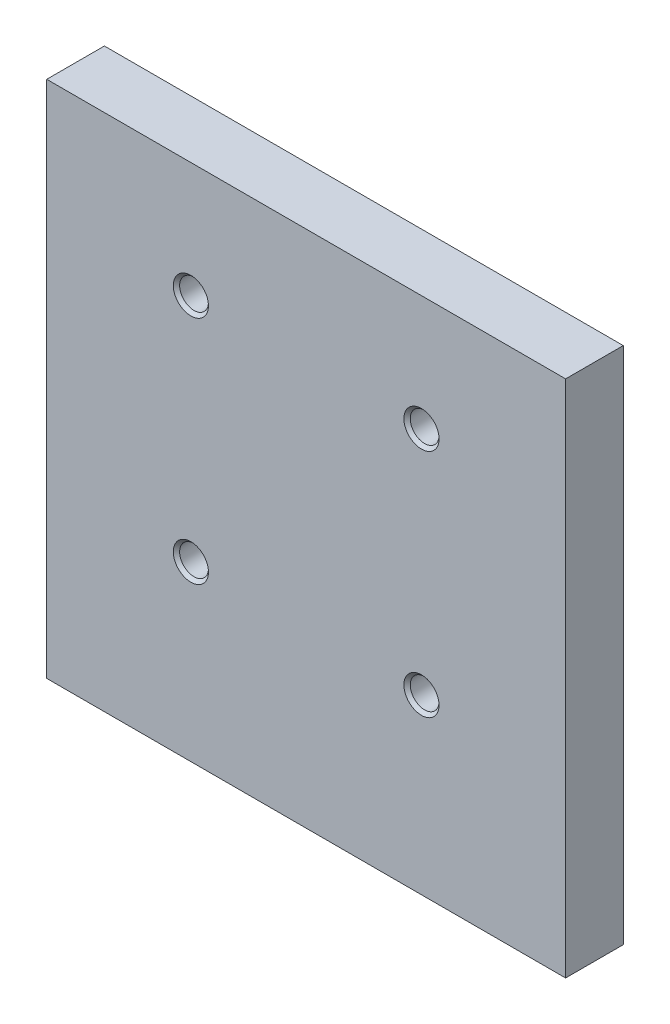
ISO-10303-21;
HEADER;
FILE_DESCRIPTION(('STEP AP214'),'2;1');
FILE_NAME('part.step','',(''),(''),'','','');
FILE_SCHEMA(('AUTOMOTIVE_DESIGN { 1 0 10303 214 1 1 1 1 }'));
ENDSEC;
DATA;
#1=APPLICATION_CONTEXT('core data for automotive mechanical design processes');
#2=APPLICATION_PROTOCOL_DEFINITION('international standard','automotive_design',2000,#1);
#3=PRODUCT_CONTEXT('',#1,'mechanical');
#4=PRODUCT('Part','Part','',(#3));
#5=PRODUCT_RELATED_PRODUCT_CATEGORY('part','',(#4));
#6=PRODUCT_DEFINITION_FORMATION('','',#4);
#7=PRODUCT_DEFINITION_CONTEXT('part definition',#1,'design');
#8=PRODUCT_DEFINITION('design','',#6,#7);
#9=PRODUCT_DEFINITION_SHAPE('','',#8);
#10=(LENGTH_UNIT() NAMED_UNIT(*) SI_UNIT(.MILLI.,.METRE.));
#11=(NAMED_UNIT(*) PLANE_ANGLE_UNIT() SI_UNIT($,.RADIAN.));
#12=(NAMED_UNIT(*) SI_UNIT($,.STERADIAN.) SOLID_ANGLE_UNIT());
#13=UNCERTAINTY_MEASURE_WITH_UNIT(LENGTH_MEASURE(1.E-05),#10,'distance_accuracy_value','');
#14=(GEOMETRIC_REPRESENTATION_CONTEXT(3) GLOBAL_UNCERTAINTY_ASSIGNED_CONTEXT((#13)) GLOBAL_UNIT_ASSIGNED_CONTEXT((#10,
#11,#12)) REPRESENTATION_CONTEXT('',''));
#15=CARTESIAN_POINT('',(0.,0.,0.));
#16=DIRECTION('',(0.,0.,1.));
#17=DIRECTION('',(1.,0.,0.));
#18=AXIS2_PLACEMENT_3D('',#15,#16,#17);
#19=CARTESIAN_POINT('',(0.,0.,5.));
#20=DIRECTION('',(1.,0.,0.));
#21=DIRECTION('',(0.,0.,-1.));
#22=AXIS2_PLACEMENT_3D('',#19,#20,#21);
#23=PLANE('',#22);
#24=DIRECTION('',(0.,-1.,0.));
#25=VECTOR('',#24,1.);
#26=CARTESIAN_POINT('',(0.,0.,0.));
#27=LINE('',#26,#25);
#28=CARTESIAN_POINT('',(0.,45.,0.));
#29=VERTEX_POINT('',#28);
#30=CARTESIAN_POINT('',(0.,0.,0.));
#31=VERTEX_POINT('',#30);
#32=EDGE_CURVE('E125',#29,#31,#27,.T.);
#33=ORIENTED_EDGE('',*,*,#32,.T.);
#34=DIRECTION('',(0.,0.,-1.));
#35=VECTOR('',#34,1.);
#36=CARTESIAN_POINT('',(0.,0.,5.));
#37=LINE('',#36,#35);
#38=CARTESIAN_POINT('',(0.,0.,5.));
#39=VERTEX_POINT('',#38);
#40=EDGE_CURVE('E11',#39,#31,#37,.T.);
#41=ORIENTED_EDGE('',*,*,#40,.F.);
#42=DIRECTION('',(0.,-1.,0.));
#43=VECTOR('',#42,1.);
#44=CARTESIAN_POINT('',(0.,0.,5.));
#45=LINE('',#44,#43);
#46=CARTESIAN_POINT('',(0.,45.,5.));
#47=VERTEX_POINT('',#46);
#48=EDGE_CURVE('E107',#47,#39,#45,.T.);
#49=ORIENTED_EDGE('',*,*,#48,.F.);
#50=DIRECTION('',(0.,0.,-1.));
#51=VECTOR('',#50,1.);
#52=CARTESIAN_POINT('',(0.,45.,5.));
#53=LINE('',#52,#51);
#54=EDGE_CURVE('E121',#47,#29,#53,.T.);
#55=ORIENTED_EDGE('',*,*,#54,.T.);
#56=EDGE_LOOP('',(#33,#41,#49,#55));
#57=FACE_BOUND('',#56,.T.);
#58=ADVANCED_FACE('F55',(#57),#23,.F.);
#59=CARTESIAN_POINT('',(0.,0.,5.));
#60=DIRECTION('',(0.,1.,0.));
#61=DIRECTION('',(0.,0.,1.));
#62=AXIS2_PLACEMENT_3D('',#59,#60,#61);
#63=PLANE('',#62);
#64=DIRECTION('',(1.,0.,0.));
#65=VECTOR('',#64,1.);
#66=CARTESIAN_POINT('',(0.,0.,0.));
#67=LINE('',#66,#65);
#68=CARTESIAN_POINT('',(45.,0.,0.));
#69=VERTEX_POINT('',#68);
#70=EDGE_CURVE('E112',#31,#69,#67,.T.);
#71=ORIENTED_EDGE('',*,*,#70,.T.);
#72=DIRECTION('',(0.,0.,-1.));
#73=VECTOR('',#72,1.);
#74=CARTESIAN_POINT('',(45.,0.,5.));
#75=LINE('',#74,#73);
#76=CARTESIAN_POINT('',(45.,0.,5.));
#77=VERTEX_POINT('',#76);
#78=EDGE_CURVE('E64',#77,#69,#75,.T.);
#79=ORIENTED_EDGE('',*,*,#78,.F.);
#80=DIRECTION('',(1.,0.,0.));
#81=VECTOR('',#80,1.);
#82=CARTESIAN_POINT('',(0.,0.,5.));
#83=LINE('',#82,#81);
#84=EDGE_CURVE('E102',#39,#77,#83,.T.);
#85=ORIENTED_EDGE('',*,*,#84,.F.);
#86=ORIENTED_EDGE('',*,*,#40,.T.);
#87=EDGE_LOOP('',(#71,#79,#85,#86));
#88=FACE_BOUND('',#87,.T.);
#89=ADVANCED_FACE('F111',(#88),#63,.F.);
#90=CARTESIAN_POINT('',(45.,0.,5.));
#91=DIRECTION('',(-1.,0.,0.));
#92=DIRECTION('',(0.,0.,1.));
#93=AXIS2_PLACEMENT_3D('',#90,#91,#92);
#94=PLANE('',#93);
#95=DIRECTION('',(0.,1.,0.));
#96=VECTOR('',#95,1.);
#97=CARTESIAN_POINT('',(45.,0.,0.));
#98=LINE('',#97,#96);
#99=CARTESIAN_POINT('',(45.,45.,0.));
#100=VERTEX_POINT('',#99);
#101=EDGE_CURVE('E89',#69,#100,#98,.T.);
#102=ORIENTED_EDGE('',*,*,#101,.T.);
#103=DIRECTION('',(0.,0.,-1.));
#104=VECTOR('',#103,1.);
#105=CARTESIAN_POINT('',(45.,45.,5.));
#106=LINE('',#105,#104);
#107=CARTESIAN_POINT('',(45.,45.,5.));
#108=VERTEX_POINT('',#107);
#109=EDGE_CURVE('E114',#108,#100,#106,.T.);
#110=ORIENTED_EDGE('',*,*,#109,.F.);
#111=DIRECTION('',(0.,1.,0.));
#112=VECTOR('',#111,1.);
#113=CARTESIAN_POINT('',(45.,0.,5.));
#114=LINE('',#113,#112);
#115=EDGE_CURVE('E105',#77,#108,#114,.T.);
#116=ORIENTED_EDGE('',*,*,#115,.F.);
#117=ORIENTED_EDGE('',*,*,#78,.T.);
#118=EDGE_LOOP('',(#102,#110,#116,#117));
#119=FACE_BOUND('',#118,.T.);
#120=ADVANCED_FACE('F115',(#119),#94,.F.);
#121=CARTESIAN_POINT('',(0.,45.,5.));
#122=DIRECTION('',(0.,-1.,0.));
#123=DIRECTION('',(0.,0.,-1.));
#124=AXIS2_PLACEMENT_3D('',#121,#122,#123);
#125=PLANE('',#124);
#126=DIRECTION('',(-1.,0.,0.));
#127=VECTOR('',#126,1.);
#128=CARTESIAN_POINT('',(0.,45.,0.));
#129=LINE('',#128,#127);
#130=EDGE_CURVE('E95',#100,#29,#129,.T.);
#131=ORIENTED_EDGE('',*,*,#130,.T.);
#132=ORIENTED_EDGE('',*,*,#54,.F.);
#133=DIRECTION('',(-1.,0.,0.));
#134=VECTOR('',#133,1.);
#135=CARTESIAN_POINT('',(0.,45.,5.));
#136=LINE('',#135,#134);
#137=EDGE_CURVE('E72',#108,#47,#136,.T.);
#138=ORIENTED_EDGE('',*,*,#137,.F.);
#139=ORIENTED_EDGE('',*,*,#109,.T.);
#140=EDGE_LOOP('',(#131,#132,#138,#139));
#141=FACE_BOUND('',#140,.T.);
#142=ADVANCED_FACE('F141',(#141),#125,.F.);
#143=CARTESIAN_POINT('',(0.,0.,5.));
#144=DIRECTION('',(0.,0.,-1.));
#145=DIRECTION('',(-1.,0.,0.));
#146=AXIS2_PLACEMENT_3D('',#143,#144,#145);
#147=PLANE('',#146);
#148=CARTESIAN_POINT('',(12.5,35.,5.));
#149=DIRECTION('',(0.,0.,1.));
#150=DIRECTION('',(1.,0.,0.));
#151=AXIS2_PLACEMENT_3D('',#148,#149,#150);
#152=CIRCLE('',#151,1.525);
#153=CARTESIAN_POINT('',(14.025,35.,5.));
#154=VERTEX_POINT('',#153);
#155=EDGE_CURVE('E191',#154,#154,#152,.T.);
#156=ORIENTED_EDGE('',*,*,#155,.F.);
#157=EDGE_LOOP('',(#156));
#158=FACE_BOUND('',#157,.T.);
#159=CARTESIAN_POINT('',(32.5,35.,5.));
#160=DIRECTION('',(0.,0.,1.));
#161=DIRECTION('',(1.,0.,0.));
#162=AXIS2_PLACEMENT_3D('',#159,#160,#161);
#163=CIRCLE('',#162,1.525);
#164=CARTESIAN_POINT('',(34.025,35.,5.));
#165=VERTEX_POINT('',#164);
#166=EDGE_CURVE('E179',#165,#165,#163,.T.);
#167=ORIENTED_EDGE('',*,*,#166,.F.);
#168=EDGE_LOOP('',(#167));
#169=FACE_BOUND('',#168,.T.);
#170=CARTESIAN_POINT('',(32.5,15.,5.));
#171=DIRECTION('',(0.,0.,1.));
#172=DIRECTION('',(1.,0.,0.));
#173=AXIS2_PLACEMENT_3D('',#170,#171,#172);
#174=CIRCLE('',#173,1.525);
#175=CARTESIAN_POINT('',(34.025,15.,5.));
#176=VERTEX_POINT('',#175);
#177=EDGE_CURVE('E168',#176,#176,#174,.T.);
#178=ORIENTED_EDGE('',*,*,#177,.F.);
#179=EDGE_LOOP('',(#178));
#180=FACE_BOUND('',#179,.T.);
#181=CARTESIAN_POINT('',(12.5,15.,5.));
#182=DIRECTION('',(0.,0.,1.));
#183=DIRECTION('',(1.,0.,0.));
#184=AXIS2_PLACEMENT_3D('',#181,#182,#183);
#185=CIRCLE('',#184,1.525);
#186=CARTESIAN_POINT('',(14.025,15.,5.));
#187=VERTEX_POINT('',#186);
#188=EDGE_CURVE('E156',#187,#187,#185,.T.);
#189=ORIENTED_EDGE('',*,*,#188,.F.);
#190=EDGE_LOOP('',(#189));
#191=FACE_BOUND('',#190,.T.);
#192=ORIENTED_EDGE('',*,*,#48,.T.);
#193=ORIENTED_EDGE('',*,*,#84,.T.);
#194=ORIENTED_EDGE('',*,*,#115,.T.);
#195=ORIENTED_EDGE('',*,*,#137,.T.);
#196=EDGE_LOOP('',(#192,#193,#194,#195));
#197=FACE_BOUND('',#196,.T.);
#198=ADVANCED_FACE('F103',(#158,#169,#180,#191,#197),#147,.F.);
#199=CARTESIAN_POINT('',(0.,0.,0.));
#200=DIRECTION('',(0.,0.,-1.));
#201=DIRECTION('',(-1.,0.,0.));
#202=AXIS2_PLACEMENT_3D('',#199,#200,#201);
#203=PLANE('',#202);
#204=CARTESIAN_POINT('',(12.5,35.,0.));
#205=DIRECTION('',(0.,0.,1.));
#206=DIRECTION('',(1.,0.,0.));
#207=AXIS2_PLACEMENT_3D('',#204,#205,#206);
#208=CIRCLE('',#207,1.25);
#209=CARTESIAN_POINT('',(13.75,35.,0.));
#210=VERTEX_POINT('',#209);
#211=EDGE_CURVE('E183',#210,#210,#208,.T.);
#212=ORIENTED_EDGE('',*,*,#211,.T.);
#213=EDGE_LOOP('',(#212));
#214=FACE_BOUND('',#213,.T.);
#215=CARTESIAN_POINT('',(32.5,35.,0.));
#216=DIRECTION('',(0.,0.,1.));
#217=DIRECTION('',(1.,0.,0.));
#218=AXIS2_PLACEMENT_3D('',#215,#216,#217);
#219=CIRCLE('',#218,1.25);
#220=CARTESIAN_POINT('',(33.75,35.,0.));
#221=VERTEX_POINT('',#220);
#222=EDGE_CURVE('E172',#221,#221,#219,.T.);
#223=ORIENTED_EDGE('',*,*,#222,.T.);
#224=EDGE_LOOP('',(#223));
#225=FACE_BOUND('',#224,.T.);
#226=CARTESIAN_POINT('',(32.5,15.,0.));
#227=DIRECTION('',(0.,0.,1.));
#228=DIRECTION('',(1.,0.,0.));
#229=AXIS2_PLACEMENT_3D('',#226,#227,#228);
#230=CIRCLE('',#229,1.25);
#231=CARTESIAN_POINT('',(33.75,15.,0.));
#232=VERTEX_POINT('',#231);
#233=EDGE_CURVE('E160',#232,#232,#230,.T.);
#234=ORIENTED_EDGE('',*,*,#233,.T.);
#235=EDGE_LOOP('',(#234));
#236=FACE_BOUND('',#235,.T.);
#237=CARTESIAN_POINT('',(12.5,15.,0.));
#238=DIRECTION('',(0.,0.,1.));
#239=DIRECTION('',(1.,0.,0.));
#240=AXIS2_PLACEMENT_3D('',#237,#238,#239);
#241=CIRCLE('',#240,1.25);
#242=CARTESIAN_POINT('',(13.75,15.,0.));
#243=VERTEX_POINT('',#242);
#244=EDGE_CURVE('E129',#243,#243,#241,.T.);
#245=ORIENTED_EDGE('',*,*,#244,.T.);
#246=EDGE_LOOP('',(#245));
#247=FACE_BOUND('',#246,.T.);
#248=ORIENTED_EDGE('',*,*,#32,.F.);
#249=ORIENTED_EDGE('',*,*,#130,.F.);
#250=ORIENTED_EDGE('',*,*,#101,.F.);
#251=ORIENTED_EDGE('',*,*,#70,.F.);
#252=EDGE_LOOP('',(#248,#249,#250,#251));
#253=FACE_BOUND('',#252,.T.);
#254=ADVANCED_FACE('F144',(#214,#225,#236,#247,#253),#203,.T.);
#255=CARTESIAN_POINT('',(12.5,15.,5.));
#256=DIRECTION('',(0.,0.,1.));
#257=DIRECTION('',(1.,0.,0.));
#258=AXIS2_PLACEMENT_3D('',#255,#256,#257);
#259=CYLINDRICAL_SURFACE('',#258,1.25);
#260=ORIENTED_EDGE('',*,*,#244,.F.);
#261=EDGE_LOOP('',(#260));
#262=FACE_BOUND('',#261,.T.);
#263=CARTESIAN_POINT('',(12.5,15.,4.725));
#264=DIRECTION('',(0.,0.,1.));
#265=DIRECTION('',(1.,0.,0.));
#266=AXIS2_PLACEMENT_3D('',#263,#264,#265);
#267=CIRCLE('',#266,1.25);
#268=CARTESIAN_POINT('',(13.75,15.,4.725));
#269=VERTEX_POINT('',#268);
#270=EDGE_CURVE('E153',#269,#269,#267,.T.);
#271=ORIENTED_EDGE('',*,*,#270,.T.);
#272=EDGE_LOOP('',(#271));
#273=FACE_BOUND('',#272,.T.);
#274=ADVANCED_FACE('F210',(#262,#273),#259,.F.);
#275=CARTESIAN_POINT('',(12.5,15.,5.));
#276=DIRECTION('',(0.,0.,1.));
#277=DIRECTION('',(1.,0.,0.));
#278=AXIS2_PLACEMENT_3D('',#275,#276,#277);
#279=CONICAL_SURFACE('',#278,1.525,0.785398163397448);
#280=ORIENTED_EDGE('',*,*,#270,.F.);
#281=EDGE_LOOP('',(#280));
#282=FACE_BOUND('',#281,.T.);
#283=ORIENTED_EDGE('',*,*,#188,.T.);
#284=EDGE_LOOP('',(#283));
#285=FACE_BOUND('',#284,.T.);
#286=ADVANCED_FACE('F207',(#282,#285),#279,.F.);
#287=CARTESIAN_POINT('',(32.5,15.,5.));
#288=DIRECTION('',(0.,0.,1.));
#289=DIRECTION('',(1.,0.,0.));
#290=AXIS2_PLACEMENT_3D('',#287,#288,#289);
#291=CYLINDRICAL_SURFACE('',#290,1.25);
#292=ORIENTED_EDGE('',*,*,#233,.F.);
#293=EDGE_LOOP('',(#292));
#294=FACE_BOUND('',#293,.T.);
#295=CARTESIAN_POINT('',(32.5,15.,4.725));
#296=DIRECTION('',(0.,0.,1.));
#297=DIRECTION('',(1.,0.,0.));
#298=AXIS2_PLACEMENT_3D('',#295,#296,#297);
#299=CIRCLE('',#298,1.25);
#300=CARTESIAN_POINT('',(33.75,15.,4.725));
#301=VERTEX_POINT('',#300);
#302=EDGE_CURVE('E164',#301,#301,#299,.T.);
#303=ORIENTED_EDGE('',*,*,#302,.T.);
#304=EDGE_LOOP('',(#303));
#305=FACE_BOUND('',#304,.T.);
#306=ADVANCED_FACE('F209',(#294,#305),#291,.F.);
#307=CARTESIAN_POINT('',(32.5,15.,5.));
#308=DIRECTION('',(0.,0.,1.));
#309=DIRECTION('',(1.,0.,0.));
#310=AXIS2_PLACEMENT_3D('',#307,#308,#309);
#311=CONICAL_SURFACE('',#310,1.525,0.785398163397442);
#312=ORIENTED_EDGE('',*,*,#302,.F.);
#313=EDGE_LOOP('',(#312));
#314=FACE_BOUND('',#313,.T.);
#315=ORIENTED_EDGE('',*,*,#177,.T.);
#316=EDGE_LOOP('',(#315));
#317=FACE_BOUND('',#316,.T.);
#318=ADVANCED_FACE('F217',(#314,#317),#311,.F.);
#319=CARTESIAN_POINT('',(32.5,35.,5.));
#320=DIRECTION('',(0.,0.,1.));
#321=DIRECTION('',(1.,0.,0.));
#322=AXIS2_PLACEMENT_3D('',#319,#320,#321);
#323=CYLINDRICAL_SURFACE('',#322,1.25);
#324=ORIENTED_EDGE('',*,*,#222,.F.);
#325=EDGE_LOOP('',(#324));
#326=FACE_BOUND('',#325,.T.);
#327=CARTESIAN_POINT('',(32.5,35.,4.725));
#328=DIRECTION('',(0.,0.,1.));
#329=DIRECTION('',(1.,0.,0.));
#330=AXIS2_PLACEMENT_3D('',#327,#328,#329);
#331=CIRCLE('',#330,1.25);
#332=CARTESIAN_POINT('',(33.75,35.,4.725));
#333=VERTEX_POINT('',#332);
#334=EDGE_CURVE('E175',#333,#333,#331,.T.);
#335=ORIENTED_EDGE('',*,*,#334,.T.);
#336=EDGE_LOOP('',(#335));
#337=FACE_BOUND('',#336,.T.);
#338=ADVANCED_FACE('F249',(#326,#337),#323,.F.);
#339=CARTESIAN_POINT('',(32.5,35.,5.));
#340=DIRECTION('',(0.,0.,1.));
#341=DIRECTION('',(1.,0.,0.));
#342=AXIS2_PLACEMENT_3D('',#339,#340,#341);
#343=CONICAL_SURFACE('',#342,1.525,0.785398163397442);
#344=ORIENTED_EDGE('',*,*,#334,.F.);
#345=EDGE_LOOP('',(#344));
#346=FACE_BOUND('',#345,.T.);
#347=ORIENTED_EDGE('',*,*,#166,.T.);
#348=EDGE_LOOP('',(#347));
#349=FACE_BOUND('',#348,.T.);
#350=ADVANCED_FACE('F254',(#346,#349),#343,.F.);
#351=CARTESIAN_POINT('',(12.5,35.,5.));
#352=DIRECTION('',(0.,0.,1.));
#353=DIRECTION('',(1.,0.,0.));
#354=AXIS2_PLACEMENT_3D('',#351,#352,#353);
#355=CYLINDRICAL_SURFACE('',#354,1.25);
#356=ORIENTED_EDGE('',*,*,#211,.F.);
#357=EDGE_LOOP('',(#356));
#358=FACE_BOUND('',#357,.T.);
#359=CARTESIAN_POINT('',(12.5,35.,4.725));
#360=DIRECTION('',(0.,0.,1.));
#361=DIRECTION('',(1.,0.,0.));
#362=AXIS2_PLACEMENT_3D('',#359,#360,#361);
#363=CIRCLE('',#362,1.25);
#364=CARTESIAN_POINT('',(13.75,35.,4.725));
#365=VERTEX_POINT('',#364);
#366=EDGE_CURVE('E187',#365,#365,#363,.T.);
#367=ORIENTED_EDGE('',*,*,#366,.T.);
#368=EDGE_LOOP('',(#367));
#369=FACE_BOUND('',#368,.T.);
#370=ADVANCED_FACE('F260',(#358,#369),#355,.F.);
#371=CARTESIAN_POINT('',(12.5,35.,5.));
#372=DIRECTION('',(0.,0.,1.));
#373=DIRECTION('',(1.,0.,0.));
#374=AXIS2_PLACEMENT_3D('',#371,#372,#373);
#375=CONICAL_SURFACE('',#374,1.525,0.785398163397448);
#376=ORIENTED_EDGE('',*,*,#366,.F.);
#377=EDGE_LOOP('',(#376));
#378=FACE_BOUND('',#377,.T.);
#379=ORIENTED_EDGE('',*,*,#155,.T.);
#380=EDGE_LOOP('',(#379));
#381=FACE_BOUND('',#380,.T.);
#382=ADVANCED_FACE('F196',(#378,#381),#375,.F.);
#383=CLOSED_SHELL('',(#58,#89,#120,#142,#198,#254,#274,#286,#306,#318,#338,#350,#370,#382));
#384=MANIFOLD_SOLID_BREP('B2',#383);
#385=ADVANCED_BREP_SHAPE_REPRESENTATION('',(#18,#384),#14);
#386=SHAPE_DEFINITION_REPRESENTATION(#9,#385);
ENDSEC;
END-ISO-10303-21;
